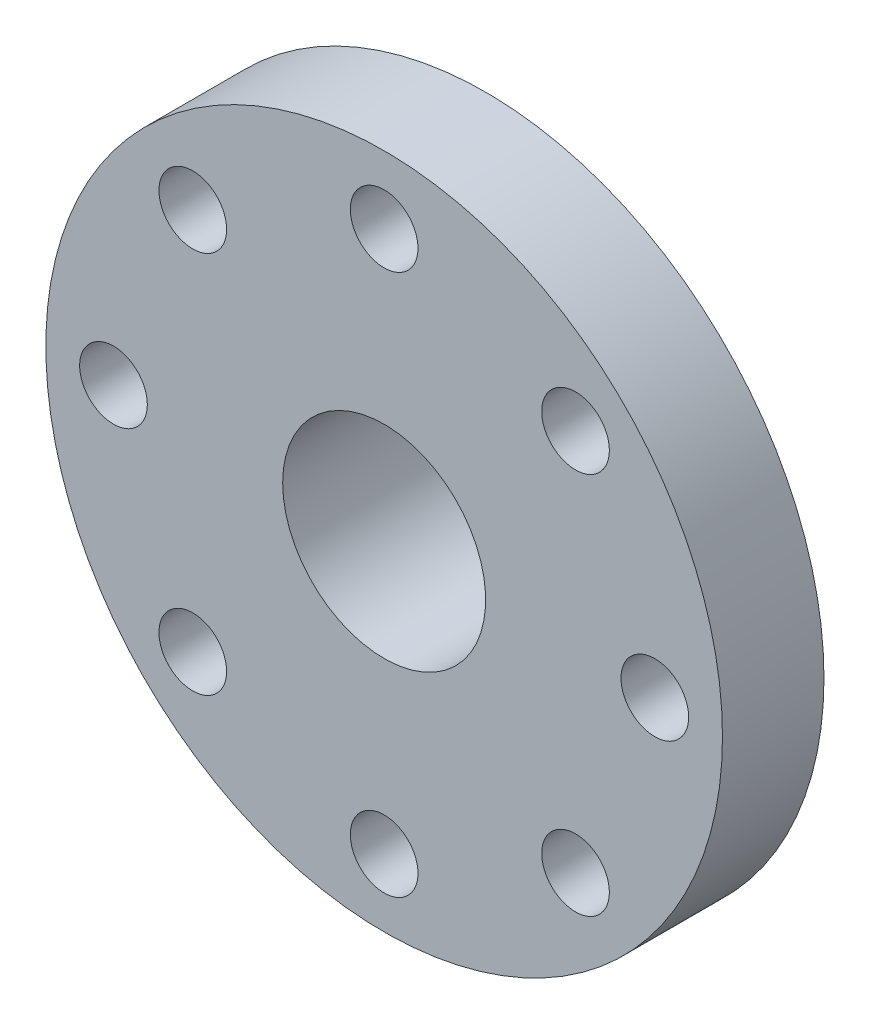
ISO-10303-21;
HEADER;
FILE_DESCRIPTION(('STEP AP214'),'2;1');
FILE_NAME('part.step','',(''),(''),'','','');
FILE_SCHEMA(('AUTOMOTIVE_DESIGN { 1 0 10303 214 1 1 1 1 }'));
ENDSEC;
DATA;
#1=APPLICATION_CONTEXT('core data for automotive mechanical design processes');
#2=APPLICATION_PROTOCOL_DEFINITION('international standard','automotive_design',2000,#1);
#3=PRODUCT_CONTEXT('',#1,'mechanical');
#4=PRODUCT('Part','Part','',(#3));
#5=PRODUCT_RELATED_PRODUCT_CATEGORY('part','',(#4));
#6=PRODUCT_DEFINITION_FORMATION('','',#4);
#7=PRODUCT_DEFINITION_CONTEXT('part definition',#1,'design');
#8=PRODUCT_DEFINITION('design','',#6,#7);
#9=PRODUCT_DEFINITION_SHAPE('','',#8);
#10=(LENGTH_UNIT() NAMED_UNIT(*) SI_UNIT(.MILLI.,.METRE.));
#11=(NAMED_UNIT(*) PLANE_ANGLE_UNIT() SI_UNIT($,.RADIAN.));
#12=(NAMED_UNIT(*) SI_UNIT($,.STERADIAN.) SOLID_ANGLE_UNIT());
#13=UNCERTAINTY_MEASURE_WITH_UNIT(LENGTH_MEASURE(1.E-05),#10,'distance_accuracy_value','');
#14=(GEOMETRIC_REPRESENTATION_CONTEXT(3) GLOBAL_UNCERTAINTY_ASSIGNED_CONTEXT((#13)) GLOBAL_UNIT_ASSIGNED_CONTEXT((#10,
#11,#12)) REPRESENTATION_CONTEXT('',''));
#15=CARTESIAN_POINT('',(0.,0.,0.));
#16=DIRECTION('',(0.,0.,1.));
#17=DIRECTION('',(1.,0.,0.));
#18=AXIS2_PLACEMENT_3D('',#15,#16,#17);
#19=CARTESIAN_POINT('',(0.,0.,3.));
#20=DIRECTION('',(0.,0.,1.));
#21=DIRECTION('',(1.,0.,0.));
#22=AXIS2_PLACEMENT_3D('',#19,#20,#21);
#23=PLANE('',#22);
#24=CARTESIAN_POINT('',(0.,0.,3.));
#25=DIRECTION('',(0.,0.,-1.));
#26=DIRECTION('',(-1.,0.,0.));
#27=AXIS2_PLACEMENT_3D('',#24,#25,#26);
#28=CIRCLE('',#27,3.);
#29=CARTESIAN_POINT('',(-3.,0.,3.));
#30=VERTEX_POINT('',#29);
#31=EDGE_CURVE('E105',#30,#30,#28,.T.);
#32=ORIENTED_EDGE('',*,*,#31,.T.);
#33=EDGE_LOOP('',(#32));
#34=FACE_BOUND('',#33,.T.);
#35=CARTESIAN_POINT('',(-7.99999999999966,-3.4057065444519E-13,3.));
#36=DIRECTION('',(0.,0.,1.));
#37=DIRECTION('',(1.,0.,0.));
#38=AXIS2_PLACEMENT_3D('',#35,#36,#37);
#39=CIRCLE('',#38,1.00000000000051);
#40=CARTESIAN_POINT('',(-6.99999999999916,-3.4057065444519E-13,3.));
#41=VERTEX_POINT('',#40);
#42=EDGE_CURVE('E88',#41,#41,#39,.T.);
#43=ORIENTED_EDGE('',*,*,#42,.F.);
#44=EDGE_LOOP('',(#43));
#45=FACE_BOUND('',#44,.T.);
#46=CARTESIAN_POINT('',(6.79181874011743E-13,-8.,3.));
#47=DIRECTION('',(0.,0.,1.));
#48=DIRECTION('',(1.,0.,0.));
#49=AXIS2_PLACEMENT_3D('',#46,#47,#48);
#50=CIRCLE('',#49,1.00000000000071);
#51=CARTESIAN_POINT('',(1.00000000000138,-8.,3.));
#52=VERTEX_POINT('',#51);
#53=EDGE_CURVE('E76',#52,#52,#50,.T.);
#54=ORIENTED_EDGE('',*,*,#53,.F.);
#55=EDGE_LOOP('',(#54));
#56=FACE_BOUND('',#55,.T.);
#57=CARTESIAN_POINT('',(8.00000000000034,3.39590937005872E-13,3.));
#58=DIRECTION('',(0.,0.,1.));
#59=DIRECTION('',(1.,0.,0.));
#60=AXIS2_PLACEMENT_3D('',#57,#58,#59);
#61=CIRCLE('',#60,1.00000000000026);
#62=CARTESIAN_POINT('',(9.0000000000006,3.39590937005872E-13,3.));
#63=VERTEX_POINT('',#62);
#64=EDGE_CURVE('E64',#63,#63,#61,.T.);
#65=ORIENTED_EDGE('',*,*,#64,.F.);
#66=EDGE_LOOP('',(#65));
#67=FACE_BOUND('',#66,.T.);
#68=CARTESIAN_POINT('',(0.,8.00000000000001,3.));
#69=DIRECTION('',(0.,0.,1.));
#70=DIRECTION('',(1.,0.,0.));
#71=AXIS2_PLACEMENT_3D('',#68,#69,#70);
#72=CIRCLE('',#71,1.);
#73=CARTESIAN_POINT('',(1.,8.00000000000001,3.));
#74=VERTEX_POINT('',#73);
#75=EDGE_CURVE('E53',#74,#74,#72,.T.);
#76=ORIENTED_EDGE('',*,*,#75,.F.);
#77=EDGE_LOOP('',(#76));
#78=FACE_BOUND('',#77,.T.);
#79=CARTESIAN_POINT('',(0.,0.,3.));
#80=DIRECTION('',(0.,0.,1.));
#81=DIRECTION('',(1.,0.,0.));
#82=AXIS2_PLACEMENT_3D('',#79,#80,#81);
#83=CIRCLE('',#82,10.);
#84=CARTESIAN_POINT('',(10.,0.,3.));
#85=VERTEX_POINT('',#84);
#86=EDGE_CURVE('E44',#85,#85,#83,.T.);
#87=ORIENTED_EDGE('',*,*,#86,.T.);
#88=EDGE_LOOP('',(#87));
#89=FACE_BOUND('',#88,.T.);
#90=CARTESIAN_POINT('',(5.6568542494924,5.65685424949238,3.));
#91=DIRECTION('',(0.,0.,1.));
#92=DIRECTION('',(1.,0.,0.));
#93=AXIS2_PLACEMENT_3D('',#90,#91,#92);
#94=CIRCLE('',#93,1.);
#95=CARTESIAN_POINT('',(6.6568542494924,5.65685424949238,3.));
#96=VERTEX_POINT('',#95);
#97=EDGE_CURVE('E58',#96,#96,#94,.T.);
#98=ORIENTED_EDGE('',*,*,#97,.F.);
#99=EDGE_LOOP('',(#98));
#100=FACE_BOUND('',#99,.T.);
#101=CARTESIAN_POINT('',(5.65685424949296,-5.65685424949214,3.));
#102=DIRECTION('',(0.,0.,1.));
#103=DIRECTION('',(1.,0.,0.));
#104=AXIS2_PLACEMENT_3D('',#101,#102,#103);
#105=CIRCLE('',#104,1.00000000000053);
#106=CARTESIAN_POINT('',(6.65685424949349,-5.65685424949214,3.));
#107=VERTEX_POINT('',#106);
#108=EDGE_CURVE('E70',#107,#107,#105,.T.);
#109=ORIENTED_EDGE('',*,*,#108,.F.);
#110=EDGE_LOOP('',(#109));
#111=FACE_BOUND('',#110,.T.);
#112=CARTESIAN_POINT('',(-5.6568542494918,-5.65685424949262,3.));
#113=DIRECTION('',(0.,0.,1.));
#114=DIRECTION('',(1.,0.,0.));
#115=AXIS2_PLACEMENT_3D('',#112,#113,#114);
#116=CIRCLE('',#115,1.00000000000069);
#117=CARTESIAN_POINT('',(-4.65685424949111,-5.65685424949262,3.));
#118=VERTEX_POINT('',#117);
#119=EDGE_CURVE('E82',#118,#118,#116,.T.);
#120=ORIENTED_EDGE('',*,*,#119,.F.);
#121=EDGE_LOOP('',(#120));
#122=FACE_BOUND('',#121,.T.);
#123=CARTESIAN_POINT('',(-5.65685424949231,5.65685424949245,3.));
#124=DIRECTION('',(0.,0.,1.));
#125=DIRECTION('',(1.,0.,0.));
#126=AXIS2_PLACEMENT_3D('',#123,#124,#125);
#127=CIRCLE('',#126,1.);
#128=CARTESIAN_POINT('',(-4.65685424949231,5.65685424949245,3.));
#129=VERTEX_POINT('',#128);
#130=EDGE_CURVE('E94',#129,#129,#127,.T.);
#131=ORIENTED_EDGE('',*,*,#130,.F.);
#132=EDGE_LOOP('',(#131));
#133=FACE_BOUND('',#132,.T.);
#134=ADVANCED_FACE('F37',(#34,#45,#56,#67,#78,#89,#100,#111,#122,#133),#23,.T.);
#135=CARTESIAN_POINT('',(0.,0.,0.));
#136=DIRECTION('',(0.,0.,1.));
#137=DIRECTION('',(1.,0.,0.));
#138=AXIS2_PLACEMENT_3D('',#135,#136,#137);
#139=PLANE('',#138);
#140=CARTESIAN_POINT('',(0.,0.,0.));
#141=DIRECTION('',(0.,0.,1.));
#142=DIRECTION('',(1.,0.,0.));
#143=AXIS2_PLACEMENT_3D('',#140,#141,#142);
#144=CIRCLE('',#143,5.);
#145=CARTESIAN_POINT('',(5.,0.,0.));
#146=VERTEX_POINT('',#145);
#147=EDGE_CURVE('E10',#146,#146,#144,.F.);
#148=ORIENTED_EDGE('',*,*,#147,.F.);
#149=EDGE_LOOP('',(#148));
#150=FACE_BOUND('',#149,.T.);
#151=CARTESIAN_POINT('',(0.,0.,0.));
#152=DIRECTION('',(0.,0.,1.));
#153=DIRECTION('',(1.,0.,0.));
#154=AXIS2_PLACEMENT_3D('',#151,#152,#153);
#155=CIRCLE('',#154,10.);
#156=CARTESIAN_POINT('',(10.,0.,0.));
#157=VERTEX_POINT('',#156);
#158=EDGE_CURVE('E48',#157,#157,#155,.T.);
#159=ORIENTED_EDGE('',*,*,#158,.F.);
#160=EDGE_LOOP('',(#159));
#161=FACE_BOUND('',#160,.T.);
#162=CARTESIAN_POINT('',(0.,8.00000000000001,0.));
#163=DIRECTION('',(0.,0.,1.));
#164=DIRECTION('',(1.,0.,0.));
#165=AXIS2_PLACEMENT_3D('',#162,#163,#164);
#166=CIRCLE('',#165,1.);
#167=CARTESIAN_POINT('',(1.,8.00000000000001,0.));
#168=VERTEX_POINT('',#167);
#169=EDGE_CURVE('E55',#168,#168,#166,.T.);
#170=ORIENTED_EDGE('',*,*,#169,.T.);
#171=EDGE_LOOP('',(#170));
#172=FACE_BOUND('',#171,.T.);
#173=CARTESIAN_POINT('',(5.6568542494924,5.65685424949238,0.));
#174=DIRECTION('',(0.,0.,1.));
#175=DIRECTION('',(1.,0.,0.));
#176=AXIS2_PLACEMENT_3D('',#173,#174,#175);
#177=CIRCLE('',#176,1.);
#178=CARTESIAN_POINT('',(6.6568542494924,5.65685424949238,0.));
#179=VERTEX_POINT('',#178);
#180=EDGE_CURVE('E61',#179,#179,#177,.T.);
#181=ORIENTED_EDGE('',*,*,#180,.T.);
#182=EDGE_LOOP('',(#181));
#183=FACE_BOUND('',#182,.T.);
#184=CARTESIAN_POINT('',(8.00000000000034,3.39590937005872E-13,0.));
#185=DIRECTION('',(0.,0.,1.));
#186=DIRECTION('',(1.,0.,0.));
#187=AXIS2_PLACEMENT_3D('',#184,#185,#186);
#188=CIRCLE('',#187,1.00000000000026);
#189=CARTESIAN_POINT('',(9.0000000000006,3.39590937005872E-13,0.));
#190=VERTEX_POINT('',#189);
#191=EDGE_CURVE('E67',#190,#190,#188,.T.);
#192=ORIENTED_EDGE('',*,*,#191,.T.);
#193=EDGE_LOOP('',(#192));
#194=FACE_BOUND('',#193,.T.);
#195=CARTESIAN_POINT('',(5.65685424949296,-5.65685424949214,0.));
#196=DIRECTION('',(0.,0.,1.));
#197=DIRECTION('',(1.,0.,0.));
#198=AXIS2_PLACEMENT_3D('',#195,#196,#197);
#199=CIRCLE('',#198,1.00000000000053);
#200=CARTESIAN_POINT('',(6.65685424949349,-5.65685424949214,0.));
#201=VERTEX_POINT('',#200);
#202=EDGE_CURVE('E73',#201,#201,#199,.T.);
#203=ORIENTED_EDGE('',*,*,#202,.T.);
#204=EDGE_LOOP('',(#203));
#205=FACE_BOUND('',#204,.T.);
#206=CARTESIAN_POINT('',(6.79181874011743E-13,-8.,0.));
#207=DIRECTION('',(0.,0.,1.));
#208=DIRECTION('',(1.,0.,0.));
#209=AXIS2_PLACEMENT_3D('',#206,#207,#208);
#210=CIRCLE('',#209,1.00000000000071);
#211=CARTESIAN_POINT('',(1.00000000000138,-8.,0.));
#212=VERTEX_POINT('',#211);
#213=EDGE_CURVE('E79',#212,#212,#210,.T.);
#214=ORIENTED_EDGE('',*,*,#213,.T.);
#215=EDGE_LOOP('',(#214));
#216=FACE_BOUND('',#215,.T.);
#217=CARTESIAN_POINT('',(-5.6568542494918,-5.65685424949262,0.));
#218=DIRECTION('',(0.,0.,1.));
#219=DIRECTION('',(1.,0.,0.));
#220=AXIS2_PLACEMENT_3D('',#217,#218,#219);
#221=CIRCLE('',#220,1.00000000000069);
#222=CARTESIAN_POINT('',(-4.65685424949111,-5.65685424949262,0.));
#223=VERTEX_POINT('',#222);
#224=EDGE_CURVE('E85',#223,#223,#221,.T.);
#225=ORIENTED_EDGE('',*,*,#224,.T.);
#226=EDGE_LOOP('',(#225));
#227=FACE_BOUND('',#226,.T.);
#228=CARTESIAN_POINT('',(-7.99999999999966,-3.4057065444519E-13,0.));
#229=DIRECTION('',(0.,0.,1.));
#230=DIRECTION('',(1.,0.,0.));
#231=AXIS2_PLACEMENT_3D('',#228,#229,#230);
#232=CIRCLE('',#231,1.00000000000051);
#233=CARTESIAN_POINT('',(-6.99999999999916,-3.4057065444519E-13,0.));
#234=VERTEX_POINT('',#233);
#235=EDGE_CURVE('E91',#234,#234,#232,.T.);
#236=ORIENTED_EDGE('',*,*,#235,.T.);
#237=EDGE_LOOP('',(#236));
#238=FACE_BOUND('',#237,.T.);
#239=CARTESIAN_POINT('',(-5.65685424949231,5.65685424949245,0.));
#240=DIRECTION('',(0.,0.,1.));
#241=DIRECTION('',(1.,0.,0.));
#242=AXIS2_PLACEMENT_3D('',#239,#240,#241);
#243=CIRCLE('',#242,1.);
#244=CARTESIAN_POINT('',(-4.65685424949231,5.65685424949245,0.));
#245=VERTEX_POINT('',#244);
#246=EDGE_CURVE('E97',#245,#245,#243,.T.);
#247=ORIENTED_EDGE('',*,*,#246,.T.);
#248=EDGE_LOOP('',(#247));
#249=FACE_BOUND('',#248,.T.);
#250=ADVANCED_FACE('F138',(#150,#161,#172,#183,#194,#205,#216,#227,#238,#249),#139,.F.);
#251=CARTESIAN_POINT('',(0.,0.,3.));
#252=DIRECTION('',(0.,0.,-1.));
#253=DIRECTION('',(-1.,0.,0.));
#254=AXIS2_PLACEMENT_3D('',#251,#252,#253);
#255=CYLINDRICAL_SURFACE('',#254,10.);
#256=ORIENTED_EDGE('',*,*,#86,.F.);
#257=EDGE_LOOP('',(#256));
#258=FACE_BOUND('',#257,.T.);
#259=ORIENTED_EDGE('',*,*,#158,.T.);
#260=EDGE_LOOP('',(#259));
#261=FACE_BOUND('',#260,.T.);
#262=ADVANCED_FACE('F39',(#258,#261),#255,.T.);
#263=CARTESIAN_POINT('',(0.,8.00000000000001,3.));
#264=DIRECTION('',(0.,0.,-1.));
#265=DIRECTION('',(-1.,0.,0.));
#266=AXIS2_PLACEMENT_3D('',#263,#264,#265);
#267=CYLINDRICAL_SURFACE('',#266,1.);
#268=ORIENTED_EDGE('',*,*,#75,.T.);
#269=EDGE_LOOP('',(#268));
#270=FACE_BOUND('',#269,.T.);
#271=ORIENTED_EDGE('',*,*,#169,.F.);
#272=EDGE_LOOP('',(#271));
#273=FACE_BOUND('',#272,.T.);
#274=ADVANCED_FACE('F144',(#270,#273),#267,.F.);
#275=CARTESIAN_POINT('',(5.6568542494924,5.65685424949238,3.));
#276=DIRECTION('',(0.,0.,-1.));
#277=DIRECTION('',(-1.,0.,0.));
#278=AXIS2_PLACEMENT_3D('',#275,#276,#277);
#279=CYLINDRICAL_SURFACE('',#278,1.);
#280=ORIENTED_EDGE('',*,*,#97,.T.);
#281=EDGE_LOOP('',(#280));
#282=FACE_BOUND('',#281,.T.);
#283=ORIENTED_EDGE('',*,*,#180,.F.);
#284=EDGE_LOOP('',(#283));
#285=FACE_BOUND('',#284,.T.);
#286=ADVANCED_FACE('F147',(#282,#285),#279,.F.);
#287=CARTESIAN_POINT('',(8.00000000000034,3.39590937005872E-13,3.));
#288=DIRECTION('',(0.,0.,-1.));
#289=DIRECTION('',(-1.,0.,0.));
#290=AXIS2_PLACEMENT_3D('',#287,#288,#289);
#291=CYLINDRICAL_SURFACE('',#290,1.00000000000026);
#292=ORIENTED_EDGE('',*,*,#64,.T.);
#293=EDGE_LOOP('',(#292));
#294=FACE_BOUND('',#293,.T.);
#295=ORIENTED_EDGE('',*,*,#191,.F.);
#296=EDGE_LOOP('',(#295));
#297=FACE_BOUND('',#296,.T.);
#298=ADVANCED_FACE('F151',(#294,#297),#291,.F.);
#299=CARTESIAN_POINT('',(5.65685424949296,-5.65685424949214,3.));
#300=DIRECTION('',(0.,0.,-1.));
#301=DIRECTION('',(-1.,0.,0.));
#302=AXIS2_PLACEMENT_3D('',#299,#300,#301);
#303=CYLINDRICAL_SURFACE('',#302,1.00000000000053);
#304=ORIENTED_EDGE('',*,*,#108,.T.);
#305=EDGE_LOOP('',(#304));
#306=FACE_BOUND('',#305,.T.);
#307=ORIENTED_EDGE('',*,*,#202,.F.);
#308=EDGE_LOOP('',(#307));
#309=FACE_BOUND('',#308,.T.);
#310=ADVANCED_FACE('F155',(#306,#309),#303,.F.);
#311=CARTESIAN_POINT('',(6.79181874011743E-13,-8.,3.));
#312=DIRECTION('',(0.,0.,-1.));
#313=DIRECTION('',(-1.,0.,0.));
#314=AXIS2_PLACEMENT_3D('',#311,#312,#313);
#315=CYLINDRICAL_SURFACE('',#314,1.00000000000071);
#316=ORIENTED_EDGE('',*,*,#53,.T.);
#317=EDGE_LOOP('',(#316));
#318=FACE_BOUND('',#317,.T.);
#319=ORIENTED_EDGE('',*,*,#213,.F.);
#320=EDGE_LOOP('',(#319));
#321=FACE_BOUND('',#320,.T.);
#322=ADVANCED_FACE('F159',(#318,#321),#315,.F.);
#323=CARTESIAN_POINT('',(-5.6568542494918,-5.65685424949262,3.));
#324=DIRECTION('',(0.,0.,-1.));
#325=DIRECTION('',(-1.,0.,0.));
#326=AXIS2_PLACEMENT_3D('',#323,#324,#325);
#327=CYLINDRICAL_SURFACE('',#326,1.00000000000069);
#328=ORIENTED_EDGE('',*,*,#119,.T.);
#329=EDGE_LOOP('',(#328));
#330=FACE_BOUND('',#329,.T.);
#331=ORIENTED_EDGE('',*,*,#224,.F.);
#332=EDGE_LOOP('',(#331));
#333=FACE_BOUND('',#332,.T.);
#334=ADVANCED_FACE('F163',(#330,#333),#327,.F.);
#335=CARTESIAN_POINT('',(-7.99999999999966,-3.4057065444519E-13,3.));
#336=DIRECTION('',(0.,0.,-1.));
#337=DIRECTION('',(-1.,0.,0.));
#338=AXIS2_PLACEMENT_3D('',#335,#336,#337);
#339=CYLINDRICAL_SURFACE('',#338,1.00000000000051);
#340=ORIENTED_EDGE('',*,*,#42,.T.);
#341=EDGE_LOOP('',(#340));
#342=FACE_BOUND('',#341,.T.);
#343=ORIENTED_EDGE('',*,*,#235,.F.);
#344=EDGE_LOOP('',(#343));
#345=FACE_BOUND('',#344,.T.);
#346=ADVANCED_FACE('F135',(#342,#345),#339,.F.);
#347=CARTESIAN_POINT('',(-5.65685424949231,5.65685424949245,3.));
#348=DIRECTION('',(0.,0.,-1.));
#349=DIRECTION('',(-1.,0.,0.));
#350=AXIS2_PLACEMENT_3D('',#347,#348,#349);
#351=CYLINDRICAL_SURFACE('',#350,1.);
#352=ORIENTED_EDGE('',*,*,#130,.T.);
#353=EDGE_LOOP('',(#352));
#354=FACE_BOUND('',#353,.T.);
#355=ORIENTED_EDGE('',*,*,#246,.F.);
#356=EDGE_LOOP('',(#355));
#357=FACE_BOUND('',#356,.T.);
#358=ADVANCED_FACE('F128',(#354,#357),#351,.F.);
#359=CARTESIAN_POINT('',(0.,0.,-2.));
#360=DIRECTION('',(0.,0.,1.));
#361=DIRECTION('',(1.,0.,0.));
#362=AXIS2_PLACEMENT_3D('',#359,#360,#361);
#363=CYLINDRICAL_SURFACE('',#362,5.);
#364=CARTESIAN_POINT('',(0.,0.,-2.));
#365=DIRECTION('',(0.,0.,-1.));
#366=DIRECTION('',(-1.,0.,0.));
#367=AXIS2_PLACEMENT_3D('',#364,#365,#366);
#368=CIRCLE('',#367,5.);
#369=CARTESIAN_POINT('',(-5.,0.,-2.));
#370=VERTEX_POINT('',#369);
#371=EDGE_CURVE('E100',#370,#370,#368,.T.);
#372=ORIENTED_EDGE('',*,*,#371,.F.);
#373=EDGE_LOOP('',(#372));
#374=FACE_BOUND('',#373,.T.);
#375=ORIENTED_EDGE('',*,*,#147,.T.);
#376=EDGE_LOOP('',(#375));
#377=FACE_BOUND('',#376,.T.);
#378=ADVANCED_FACE('F123',(#374,#377),#363,.T.);
#379=CARTESIAN_POINT('',(0.,0.,-2.));
#380=DIRECTION('',(0.,0.,-1.));
#381=DIRECTION('',(-1.,0.,0.));
#382=AXIS2_PLACEMENT_3D('',#379,#380,#381);
#383=PLANE('',#382);
#384=CARTESIAN_POINT('',(0.,0.,-2.));
#385=DIRECTION('',(0.,0.,-1.));
#386=DIRECTION('',(-1.,0.,0.));
#387=AXIS2_PLACEMENT_3D('',#384,#385,#386);
#388=CIRCLE('',#387,3.);
#389=CARTESIAN_POINT('',(-3.,0.,-2.));
#390=VERTEX_POINT('',#389);
#391=EDGE_CURVE('E106',#390,#390,#388,.T.);
#392=ORIENTED_EDGE('',*,*,#391,.F.);
#393=EDGE_LOOP('',(#392));
#394=FACE_BOUND('',#393,.T.);
#395=ORIENTED_EDGE('',*,*,#371,.T.);
#396=EDGE_LOOP('',(#395));
#397=FACE_BOUND('',#396,.T.);
#398=ADVANCED_FACE('F117',(#394,#397),#383,.T.);
#399=CARTESIAN_POINT('',(0.,0.,3.));
#400=DIRECTION('',(0.,0.,-1.));
#401=DIRECTION('',(-1.,0.,0.));
#402=AXIS2_PLACEMENT_3D('',#399,#400,#401);
#403=CYLINDRICAL_SURFACE('',#402,3.);
#404=ORIENTED_EDGE('',*,*,#31,.F.);
#405=EDGE_LOOP('',(#404));
#406=FACE_BOUND('',#405,.T.);
#407=ORIENTED_EDGE('',*,*,#391,.T.);
#408=EDGE_LOOP('',(#407));
#409=FACE_BOUND('',#408,.T.);
#410=ADVANCED_FACE('F114',(#406,#409),#403,.F.);
#411=CLOSED_SHELL('',(#134,#250,#262,#274,#286,#298,#310,#322,#334,#346,#358,#378,#398,#410));
#412=MANIFOLD_SOLID_BREP('B2',#411);
#413=ADVANCED_BREP_SHAPE_REPRESENTATION('',(#18,#412),#14);
#414=SHAPE_DEFINITION_REPRESENTATION(#9,#413);
ENDSEC;
END-ISO-10303-21;
